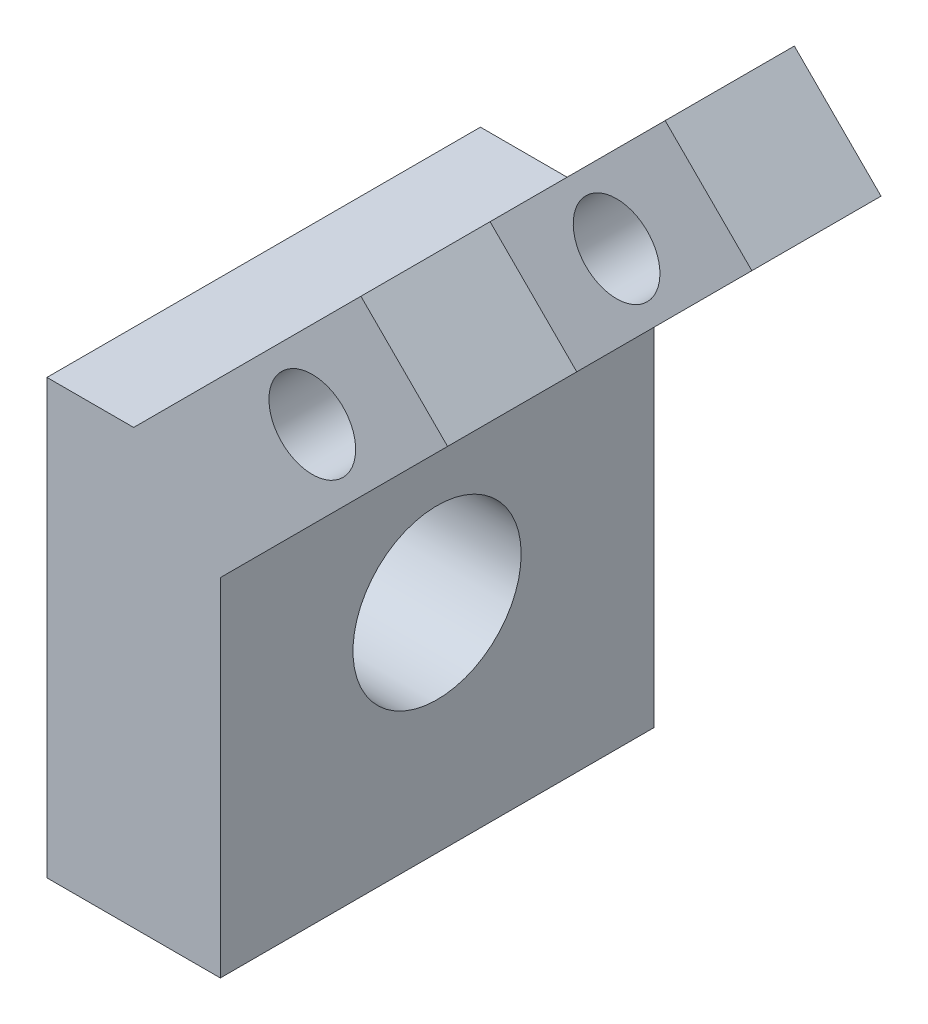
ISO-10303-21;
HEADER;
FILE_DESCRIPTION(('STEP AP214'),'2;1');
FILE_NAME('part.step','',(''),(''),'','','');
FILE_SCHEMA(('AUTOMOTIVE_DESIGN { 1 0 10303 214 1 1 1 1 }'));
ENDSEC;
DATA;
#1=APPLICATION_CONTEXT('core data for automotive mechanical design processes');
#2=APPLICATION_PROTOCOL_DEFINITION('international standard','automotive_design',2000,#1);
#3=PRODUCT_CONTEXT('',#1,'mechanical');
#4=PRODUCT('Part','Part','',(#3));
#5=PRODUCT_RELATED_PRODUCT_CATEGORY('part','',(#4));
#6=PRODUCT_DEFINITION_FORMATION('','',#4);
#7=PRODUCT_DEFINITION_CONTEXT('part definition',#1,'design');
#8=PRODUCT_DEFINITION('design','',#6,#7);
#9=PRODUCT_DEFINITION_SHAPE('','',#8);
#10=(LENGTH_UNIT() NAMED_UNIT(*) SI_UNIT(.MILLI.,.METRE.));
#11=(NAMED_UNIT(*) PLANE_ANGLE_UNIT() SI_UNIT($,.RADIAN.));
#12=(NAMED_UNIT(*) SI_UNIT($,.STERADIAN.) SOLID_ANGLE_UNIT());
#13=UNCERTAINTY_MEASURE_WITH_UNIT(LENGTH_MEASURE(1.E-05),#10,'distance_accuracy_value','');
#14=(GEOMETRIC_REPRESENTATION_CONTEXT(3) GLOBAL_UNCERTAINTY_ASSIGNED_CONTEXT((#13)) GLOBAL_UNIT_ASSIGNED_CONTEXT((#10,
#11,#12)) REPRESENTATION_CONTEXT('',''));
#15=CARTESIAN_POINT('',(0.,0.,0.));
#16=DIRECTION('',(0.,0.,1.));
#17=DIRECTION('',(1.,0.,0.));
#18=AXIS2_PLACEMENT_3D('',#15,#16,#17);
#19=CARTESIAN_POINT('',(31.154556589281,29.113189291429,18.75));
#20=DIRECTION('',(-0.707106781186549,0.707106781186546,0.));
#21=DIRECTION('',(-0.707106781186546,-0.707106781186549,0.));
#22=AXIS2_PLACEMENT_3D('',#19,#20,#21);
#23=PLANE('',#22);
#24=DIRECTION('',(0.707106781186546,0.707106781186549,0.));
#25=VECTOR('',#24,1.);
#26=CARTESIAN_POINT('',(11.4946540125837,9.4532867147316,-7.575));
#27=LINE('',#26,#25);
#28=CARTESIAN_POINT('',(11.4946540125837,9.4532867147316,-7.575));
#29=VERTEX_POINT('',#28);
#30=CARTESIAN_POINT('',(31.154556589281,29.113189291429,-7.575));
#31=VERTEX_POINT('',#30);
#32=EDGE_CURVE('E124',#29,#31,#27,.T.);
#33=ORIENTED_EDGE('',*,*,#32,.F.);
#34=DIRECTION('',(0.,0.,-1.));
#35=VECTOR('',#34,1.);
#36=CARTESIAN_POINT('',(11.4946540125837,9.4532867147316,18.75));
#37=LINE('',#36,#35);
#38=CARTESIAN_POINT('',(11.4946540125837,9.4532867147316,-18.75));
#39=VERTEX_POINT('',#38);
#40=EDGE_CURVE('E154',#29,#39,#37,.T.);
#41=ORIENTED_EDGE('',*,*,#40,.T.);
#42=DIRECTION('',(0.707106781186546,0.707106781186549,0.));
#43=VECTOR('',#42,1.);
#44=CARTESIAN_POINT('',(31.154556589281,29.113189291429,-18.75));
#45=LINE('',#44,#43);
#46=CARTESIAN_POINT('',(31.154556589281,29.113189291429,-18.75));
#47=VERTEX_POINT('',#46);
#48=EDGE_CURVE('E148',#39,#47,#45,.T.);
#49=ORIENTED_EDGE('',*,*,#48,.T.);
#50=DIRECTION('',(0.,0.,-1.));
#51=VECTOR('',#50,1.);
#52=CARTESIAN_POINT('',(31.154556589281,29.113189291429,18.75));
#53=LINE('',#52,#51);
#54=EDGE_CURVE('E142',#31,#47,#53,.T.);
#55=ORIENTED_EDGE('',*,*,#54,.F.);
#56=EDGE_LOOP('',(#33,#41,#49,#55));
#57=FACE_BOUND('',#56,.T.);
#58=ADVANCED_FACE('F34',(#57),#23,.F.);
#59=CARTESIAN_POINT('',(23.654556589281,36.613189291429,18.75));
#60=DIRECTION('',(-0.707106781186546,-0.707106781186549,0.));
#61=DIRECTION('',(0.707106781186549,-0.707106781186546,0.));
#62=AXIS2_PLACEMENT_3D('',#59,#60,#61);
#63=PLANE('',#62);
#64=DIRECTION('',(-0.707106781186549,0.707106781186546,0.));
#65=VECTOR('',#64,1.);
#66=CARTESIAN_POINT('',(31.154556589281,29.113189291429,-7.575));
#67=LINE('',#66,#65);
#68=CARTESIAN_POINT('',(23.654556589281,36.613189291429,-7.575));
#69=VERTEX_POINT('',#68);
#70=EDGE_CURVE('E128',#31,#69,#67,.T.);
#71=ORIENTED_EDGE('',*,*,#70,.F.);
#72=ORIENTED_EDGE('',*,*,#54,.T.);
#73=DIRECTION('',(-0.707106781186549,0.707106781186546,0.));
#74=VECTOR('',#73,1.);
#75=CARTESIAN_POINT('',(23.654556589281,36.613189291429,-18.75));
#76=LINE('',#75,#74);
#77=CARTESIAN_POINT('',(23.654556589281,36.613189291429,-18.75));
#78=VERTEX_POINT('',#77);
#79=EDGE_CURVE('E237',#47,#78,#76,.T.);
#80=ORIENTED_EDGE('',*,*,#79,.T.);
#81=DIRECTION('',(0.,0.,-1.));
#82=VECTOR('',#81,1.);
#83=CARTESIAN_POINT('',(23.654556589281,36.613189291429,18.75));
#84=LINE('',#83,#82);
#85=EDGE_CURVE('E144',#69,#78,#84,.T.);
#86=ORIENTED_EDGE('',*,*,#85,.F.);
#87=EDGE_LOOP('',(#71,#72,#80,#86));
#88=FACE_BOUND('',#87,.T.);
#89=ADVANCED_FACE('F140',(#88),#63,.F.);
#90=CARTESIAN_POINT('',(3.99465401258368,16.9532867147316,18.75));
#91=DIRECTION('',(0.707106781186549,-0.707106781186546,0.));
#92=DIRECTION('',(0.707106781186546,0.707106781186549,0.));
#93=AXIS2_PLACEMENT_3D('',#90,#91,#92);
#94=PLANE('',#93);
#95=DIRECTION('',(-0.707106781186546,-0.707106781186549,0.));
#96=VECTOR('',#95,1.);
#97=CARTESIAN_POINT('',(23.654556589281,36.613189291429,-7.575));
#98=LINE('',#97,#96);
#99=CARTESIAN_POINT('',(3.99465401258368,16.9532867147316,-7.575));
#100=VERTEX_POINT('',#99);
#101=EDGE_CURVE('E145',#69,#100,#98,.T.);
#102=ORIENTED_EDGE('',*,*,#101,.F.);
#103=ORIENTED_EDGE('',*,*,#85,.T.);
#104=DIRECTION('',(-0.707106781186546,-0.707106781186549,0.));
#105=VECTOR('',#104,1.);
#106=CARTESIAN_POINT('',(3.99465401258368,16.9532867147316,-18.75));
#107=LINE('',#106,#105);
#108=CARTESIAN_POINT('',(3.99465401258368,16.9532867147316,-18.75));
#109=VERTEX_POINT('',#108);
#110=EDGE_CURVE('E223',#78,#109,#107,.T.);
#111=ORIENTED_EDGE('',*,*,#110,.T.);
#112=DIRECTION('',(0.,0.,-1.));
#113=VECTOR('',#112,1.);
#114=CARTESIAN_POINT('',(3.99465401258368,16.9532867147316,18.75));
#115=LINE('',#114,#113);
#116=EDGE_CURVE('E232',#100,#109,#115,.T.);
#117=ORIENTED_EDGE('',*,*,#116,.F.);
#118=EDGE_LOOP('',(#102,#103,#111,#117));
#119=FACE_BOUND('',#118,.T.);
#120=ADVANCED_FACE('F245',(#119),#94,.F.);
#121=CARTESIAN_POINT('',(11.4946540125837,-1.79671328526836,0.));
#122=DIRECTION('',(1.,0.,0.));
#123=DIRECTION('',(0.,0.,-1.));
#124=AXIS2_PLACEMENT_3D('',#121,#122,#123);
#125=PLANE('',#124);
#126=CARTESIAN_POINT('',(11.4946540125837,-1.79671328526836,0.));
#127=DIRECTION('',(1.,0.,0.));
#128=DIRECTION('',(0.,0.,-1.));
#129=AXIS2_PLACEMENT_3D('',#126,#127,#128);
#130=CIRCLE('',#129,7.275);
#131=CARTESIAN_POINT('',(11.4946540125837,-1.79671328526836,-7.275));
#132=VERTEX_POINT('',#131);
#133=EDGE_CURVE('E163',#132,#132,#130,.T.);
#134=ORIENTED_EDGE('',*,*,#133,.F.);
#135=EDGE_LOOP('',(#134));
#136=FACE_BOUND('',#135,.T.);
#137=DIRECTION('',(0.,1.,0.));
#138=VECTOR('',#137,1.);
#139=CARTESIAN_POINT('',(11.4946540125837,16.9532867147316,-18.75));
#140=LINE('',#139,#138);
#141=CARTESIAN_POINT('',(11.4946540125837,-20.5467132852684,-18.75));
#142=VERTEX_POINT('',#141);
#143=EDGE_CURVE('E169',#142,#39,#140,.T.);
#144=ORIENTED_EDGE('',*,*,#143,.T.);
#145=ORIENTED_EDGE('',*,*,#40,.F.);
#146=DIRECTION('',(0.,-1.,0.));
#147=VECTOR('',#146,1.);
#148=CARTESIAN_POINT('',(11.4946540125837,9.4532867147316,-7.575));
#149=LINE('',#148,#147);
#150=CARTESIAN_POINT('',(11.4946540125837,16.9532867147316,-7.575));
#151=VERTEX_POINT('',#150);
#152=EDGE_CURVE('E132',#151,#29,#149,.T.);
#153=ORIENTED_EDGE('',*,*,#152,.F.);
#154=DIRECTION('',(0.,0.,1.));
#155=VECTOR('',#154,1.);
#156=CARTESIAN_POINT('',(11.4946540125837,16.9532867147316,-7.575));
#157=LINE('',#156,#155);
#158=CARTESIAN_POINT('',(11.4946540125837,16.9532867147316,7.575));
#159=VERTEX_POINT('',#158);
#160=EDGE_CURVE('E238',#151,#159,#157,.T.);
#161=ORIENTED_EDGE('',*,*,#160,.T.);
#162=DIRECTION('',(0.,-1.,0.));
#163=VECTOR('',#162,1.);
#164=CARTESIAN_POINT('',(11.4946540125837,9.4532867147316,7.575));
#165=LINE('',#164,#163);
#166=CARTESIAN_POINT('',(11.4946540125837,9.4532867147316,7.575));
#167=VERTEX_POINT('',#166);
#168=EDGE_CURVE('E136',#159,#167,#165,.T.);
#169=ORIENTED_EDGE('',*,*,#168,.T.);
#170=CARTESIAN_POINT('',(11.4946540125837,9.4532867147316,18.75));
#171=VERTEX_POINT('',#170);
#172=EDGE_CURVE('E159',#171,#167,#37,.T.);
#173=ORIENTED_EDGE('',*,*,#172,.F.);
#174=DIRECTION('',(0.,-1.,0.));
#175=VECTOR('',#174,1.);
#176=CARTESIAN_POINT('',(11.4946540125837,16.9532867147316,18.75));
#177=LINE('',#176,#175);
#178=CARTESIAN_POINT('',(11.4946540125837,-20.5467132852684,18.75));
#179=VERTEX_POINT('',#178);
#180=EDGE_CURVE('E172',#171,#179,#177,.T.);
#181=ORIENTED_EDGE('',*,*,#180,.T.);
#182=DIRECTION('',(0.,0.,-1.));
#183=VECTOR('',#182,1.);
#184=CARTESIAN_POINT('',(11.4946540125837,-20.5467132852684,18.75));
#185=LINE('',#184,#183);
#186=EDGE_CURVE('E175',#179,#142,#185,.T.);
#187=ORIENTED_EDGE('',*,*,#186,.T.);
#188=EDGE_LOOP('',(#144,#145,#153,#161,#169,#173,#181,#187));
#189=FACE_BOUND('',#188,.T.);
#190=ADVANCED_FACE('F214',(#136,#189),#125,.T.);
#191=CARTESIAN_POINT('',(11.4946540125837,16.9532867147316,18.75));
#192=DIRECTION('',(0.,-1.,0.));
#193=DIRECTION('',(0.,0.,-1.));
#194=AXIS2_PLACEMENT_3D('',#191,#192,#193);
#195=PLANE('',#194);
#196=CARTESIAN_POINT('',(3.99465401258368,16.9532867147316,18.75));
#197=VERTEX_POINT('',#196);
#198=CARTESIAN_POINT('',(3.99465401258368,16.9532867147316,7.575));
#199=VERTEX_POINT('',#198);
#200=EDGE_CURVE('E57',#197,#199,#115,.T.);
#201=ORIENTED_EDGE('',*,*,#200,.T.);
#202=DIRECTION('',(1.,0.,0.));
#203=VECTOR('',#202,1.);
#204=CARTESIAN_POINT('',(3.99465401258368,16.9532867147316,7.575));
#205=LINE('',#204,#203);
#206=EDGE_CURVE('E50',#199,#159,#205,.T.);
#207=ORIENTED_EDGE('',*,*,#206,.T.);
#208=ORIENTED_EDGE('',*,*,#160,.F.);
#209=DIRECTION('',(1.,0.,0.));
#210=VECTOR('',#209,1.);
#211=CARTESIAN_POINT('',(3.99465401258368,16.9532867147316,-7.575));
#212=LINE('',#211,#210);
#213=EDGE_CURVE('E242',#100,#151,#212,.T.);
#214=ORIENTED_EDGE('',*,*,#213,.F.);
#215=ORIENTED_EDGE('',*,*,#116,.T.);
#216=DIRECTION('',(-1.,0.,0.));
#217=VECTOR('',#216,1.);
#218=CARTESIAN_POINT('',(11.4946540125837,16.9532867147316,-18.75));
#219=LINE('',#218,#217);
#220=CARTESIAN_POINT('',(-3.50534598741632,16.9532867147316,-18.75));
#221=VERTEX_POINT('',#220);
#222=EDGE_CURVE('E11',#109,#221,#219,.T.);
#223=ORIENTED_EDGE('',*,*,#222,.T.);
#224=DIRECTION('',(0.,0.,1.));
#225=VECTOR('',#224,1.);
#226=CARTESIAN_POINT('',(-3.50534598741632,16.9532867147316,18.75));
#227=LINE('',#226,#225);
#228=CARTESIAN_POINT('',(-3.50534598741632,16.9532867147316,18.75));
#229=VERTEX_POINT('',#228);
#230=EDGE_CURVE('E180',#221,#229,#227,.T.);
#231=ORIENTED_EDGE('',*,*,#230,.T.);
#232=DIRECTION('',(-1.,0.,0.));
#233=VECTOR('',#232,1.);
#234=CARTESIAN_POINT('',(11.4946540125837,16.9532867147316,18.75));
#235=LINE('',#234,#233);
#236=EDGE_CURVE('E43',#197,#229,#235,.T.);
#237=ORIENTED_EDGE('',*,*,#236,.F.);
#238=EDGE_LOOP('',(#201,#207,#208,#214,#215,#223,#231,#237));
#239=FACE_BOUND('',#238,.T.);
#240=ADVANCED_FACE('F200',(#239),#195,.F.);
#241=CARTESIAN_POINT('',(-3.50534598741632,-1.79671328526836,0.));
#242=DIRECTION('',(1.,0.,0.));
#243=DIRECTION('',(0.,0.,-1.));
#244=AXIS2_PLACEMENT_3D('',#241,#242,#243);
#245=PLANE('',#244);
#246=DIRECTION('',(0.,1.,0.));
#247=VECTOR('',#246,1.);
#248=CARTESIAN_POINT('',(-3.50534598741632,16.9532867147316,-18.75));
#249=LINE('',#248,#247);
#250=CARTESIAN_POINT('',(-3.50534598741632,-20.5467132852684,-18.75));
#251=VERTEX_POINT('',#250);
#252=EDGE_CURVE('E166',#251,#221,#249,.T.);
#253=ORIENTED_EDGE('',*,*,#252,.F.);
#254=DIRECTION('',(0.,0.,-1.));
#255=VECTOR('',#254,1.);
#256=CARTESIAN_POINT('',(-3.50534598741632,-20.5467132852684,18.75));
#257=LINE('',#256,#255);
#258=CARTESIAN_POINT('',(-3.50534598741632,-20.5467132852684,18.75));
#259=VERTEX_POINT('',#258);
#260=EDGE_CURVE('E173',#259,#251,#257,.T.);
#261=ORIENTED_EDGE('',*,*,#260,.F.);
#262=DIRECTION('',(0.,-1.,0.));
#263=VECTOR('',#262,1.);
#264=CARTESIAN_POINT('',(-3.50534598741632,16.9532867147316,18.75));
#265=LINE('',#264,#263);
#266=EDGE_CURVE('E183',#229,#259,#265,.T.);
#267=ORIENTED_EDGE('',*,*,#266,.F.);
#268=ORIENTED_EDGE('',*,*,#230,.F.);
#269=EDGE_LOOP('',(#253,#261,#267,#268));
#270=FACE_BOUND('',#269,.T.);
#271=CARTESIAN_POINT('',(-3.50534598741632,-1.79671328526836,0.));
#272=DIRECTION('',(1.,0.,0.));
#273=DIRECTION('',(0.,0.,-1.));
#274=AXIS2_PLACEMENT_3D('',#271,#272,#273);
#275=CIRCLE('',#274,7.275);
#276=CARTESIAN_POINT('',(-3.50534598741632,-1.79671328526836,-7.275));
#277=VERTEX_POINT('',#276);
#278=EDGE_CURVE('E162',#277,#277,#275,.T.);
#279=ORIENTED_EDGE('',*,*,#278,.T.);
#280=EDGE_LOOP('',(#279));
#281=FACE_BOUND('',#280,.T.);
#282=ADVANCED_FACE('F205',(#270,#281),#245,.F.);
#283=CARTESIAN_POINT('',(11.4946540125837,16.9532867147316,-18.75));
#284=DIRECTION('',(0.,0.,1.));
#285=DIRECTION('',(0.,-1.,0.));
#286=AXIS2_PLACEMENT_3D('',#283,#284,#285);
#287=PLANE('',#286);
#288=CARTESIAN_POINT('',(19.4496053009323,24.9082380030803,-18.75));
#289=DIRECTION('',(0.,0.,-1.));
#290=DIRECTION('',(0.,1.,0.));
#291=AXIS2_PLACEMENT_3D('',#288,#289,#290);
#292=CIRCLE('',#291,3.75);
#293=CARTESIAN_POINT('',(19.4496053009323,28.6582380030803,-18.75));
#294=VERTEX_POINT('',#293);
#295=EDGE_CURVE('E381',#294,#294,#292,.T.);
#296=ORIENTED_EDGE('',*,*,#295,.F.);
#297=EDGE_LOOP('',(#296));
#298=FACE_BOUND('',#297,.T.);
#299=ORIENTED_EDGE('',*,*,#48,.F.);
#300=ORIENTED_EDGE('',*,*,#143,.F.);
#301=DIRECTION('',(-1.,0.,0.));
#302=VECTOR('',#301,1.);
#303=CARTESIAN_POINT('',(11.4946540125837,-20.5467132852684,-18.75));
#304=LINE('',#303,#302);
#305=EDGE_CURVE('E177',#142,#251,#304,.T.);
#306=ORIENTED_EDGE('',*,*,#305,.T.);
#307=ORIENTED_EDGE('',*,*,#252,.T.);
#308=ORIENTED_EDGE('',*,*,#222,.F.);
#309=ORIENTED_EDGE('',*,*,#110,.F.);
#310=ORIENTED_EDGE('',*,*,#79,.F.);
#311=EDGE_LOOP('',(#299,#300,#306,#307,#308,#309,#310));
#312=FACE_BOUND('',#311,.T.);
#313=ADVANCED_FACE('F36',(#298,#312),#287,.F.);
#314=CARTESIAN_POINT('',(11.4946540125837,16.9532867147316,18.75));
#315=DIRECTION('',(0.,0.,-1.));
#316=DIRECTION('',(0.,1.,0.));
#317=AXIS2_PLACEMENT_3D('',#314,#315,#316);
#318=PLANE('',#317);
#319=CARTESIAN_POINT('',(19.4496053009323,24.9082380030803,18.75));
#320=DIRECTION('',(0.,0.,-1.));
#321=DIRECTION('',(0.,1.,0.));
#322=AXIS2_PLACEMENT_3D('',#319,#320,#321);
#323=CIRCLE('',#322,3.75);
#324=CARTESIAN_POINT('',(19.4496053009323,28.6582380030803,18.75));
#325=VERTEX_POINT('',#324);
#326=EDGE_CURVE('E382',#325,#325,#323,.T.);
#327=ORIENTED_EDGE('',*,*,#326,.T.);
#328=EDGE_LOOP('',(#327));
#329=FACE_BOUND('',#328,.T.);
#330=ORIENTED_EDGE('',*,*,#180,.F.);
#331=DIRECTION('',(0.707106781186546,0.707106781186549,0.));
#332=VECTOR('',#331,1.);
#333=CARTESIAN_POINT('',(31.154556589281,29.113189291429,18.75));
#334=LINE('',#333,#332);
#335=CARTESIAN_POINT('',(31.154556589281,29.113189291429,18.75));
#336=VERTEX_POINT('',#335);
#337=EDGE_CURVE('E217',#171,#336,#334,.T.);
#338=ORIENTED_EDGE('',*,*,#337,.T.);
#339=DIRECTION('',(-0.707106781186549,0.707106781186546,0.));
#340=VECTOR('',#339,1.);
#341=CARTESIAN_POINT('',(23.654556589281,36.613189291429,18.75));
#342=LINE('',#341,#340);
#343=CARTESIAN_POINT('',(23.654556589281,36.613189291429,18.75));
#344=VERTEX_POINT('',#343);
#345=EDGE_CURVE('E220',#336,#344,#342,.T.);
#346=ORIENTED_EDGE('',*,*,#345,.T.);
#347=DIRECTION('',(-0.707106781186546,-0.707106781186549,0.));
#348=VECTOR('',#347,1.);
#349=CARTESIAN_POINT('',(3.99465401258368,16.9532867147316,18.75));
#350=LINE('',#349,#348);
#351=EDGE_CURVE('E197',#344,#197,#350,.T.);
#352=ORIENTED_EDGE('',*,*,#351,.T.);
#353=ORIENTED_EDGE('',*,*,#236,.T.);
#354=ORIENTED_EDGE('',*,*,#266,.T.);
#355=DIRECTION('',(-1.,0.,0.));
#356=VECTOR('',#355,1.);
#357=CARTESIAN_POINT('',(11.4946540125837,-20.5467132852684,18.75));
#358=LINE('',#357,#356);
#359=EDGE_CURVE('E188',#179,#259,#358,.T.);
#360=ORIENTED_EDGE('',*,*,#359,.F.);
#361=EDGE_LOOP('',(#330,#338,#346,#352,#353,#354,#360));
#362=FACE_BOUND('',#361,.T.);
#363=ADVANCED_FACE('F194',(#329,#362),#318,.F.);
#364=CARTESIAN_POINT('',(11.4946540125837,-20.5467132852684,18.75));
#365=DIRECTION('',(0.,1.,0.));
#366=DIRECTION('',(0.,0.,1.));
#367=AXIS2_PLACEMENT_3D('',#364,#365,#366);
#368=PLANE('',#367);
#369=ORIENTED_EDGE('',*,*,#260,.T.);
#370=ORIENTED_EDGE('',*,*,#305,.F.);
#371=ORIENTED_EDGE('',*,*,#186,.F.);
#372=ORIENTED_EDGE('',*,*,#359,.T.);
#373=EDGE_LOOP('',(#369,#370,#371,#372));
#374=FACE_BOUND('',#373,.T.);
#375=ADVANCED_FACE('F209',(#374),#368,.F.);
#376=CARTESIAN_POINT('',(11.4946540125837,-1.79671328526836,0.));
#377=DIRECTION('',(-1.,0.,0.));
#378=DIRECTION('',(0.,0.,1.));
#379=AXIS2_PLACEMENT_3D('',#376,#377,#378);
#380=CYLINDRICAL_SURFACE('',#379,7.275);
#381=ORIENTED_EDGE('',*,*,#133,.T.);
#382=EDGE_LOOP('',(#381));
#383=FACE_BOUND('',#382,.T.);
#384=ORIENTED_EDGE('',*,*,#278,.F.);
#385=EDGE_LOOP('',(#384));
#386=FACE_BOUND('',#385,.T.);
#387=ADVANCED_FACE('F277',(#383,#386),#380,.F.);
#388=ORIENTED_EDGE('',*,*,#172,.T.);
#389=DIRECTION('',(0.707106781186546,0.707106781186549,0.));
#390=VECTOR('',#389,1.);
#391=CARTESIAN_POINT('',(11.4946540125837,9.4532867147316,7.575));
#392=LINE('',#391,#390);
#393=CARTESIAN_POINT('',(31.154556589281,29.113189291429,7.575));
#394=VERTEX_POINT('',#393);
#395=EDGE_CURVE('E227',#167,#394,#392,.T.);
#396=ORIENTED_EDGE('',*,*,#395,.T.);
#397=EDGE_CURVE('E150',#336,#394,#53,.T.);
#398=ORIENTED_EDGE('',*,*,#397,.F.);
#399=ORIENTED_EDGE('',*,*,#337,.F.);
#400=EDGE_LOOP('',(#388,#396,#398,#399));
#401=FACE_BOUND('',#400,.T.);
#402=ADVANCED_FACE('F226',(#401),#23,.F.);
#403=ORIENTED_EDGE('',*,*,#397,.T.);
#404=DIRECTION('',(-0.707106781186549,0.707106781186546,0.));
#405=VECTOR('',#404,1.);
#406=CARTESIAN_POINT('',(31.154556589281,29.113189291429,7.575));
#407=LINE('',#406,#405);
#408=CARTESIAN_POINT('',(23.654556589281,36.613189291429,7.575));
#409=VERTEX_POINT('',#408);
#410=EDGE_CURVE('E251',#394,#409,#407,.T.);
#411=ORIENTED_EDGE('',*,*,#410,.T.);
#412=EDGE_CURVE('E151',#344,#409,#84,.T.);
#413=ORIENTED_EDGE('',*,*,#412,.F.);
#414=ORIENTED_EDGE('',*,*,#345,.F.);
#415=EDGE_LOOP('',(#403,#411,#413,#414));
#416=FACE_BOUND('',#415,.T.);
#417=ADVANCED_FACE('F230',(#416),#63,.F.);
#418=ORIENTED_EDGE('',*,*,#412,.T.);
#419=DIRECTION('',(-0.707106781186546,-0.707106781186549,0.));
#420=VECTOR('',#419,1.);
#421=CARTESIAN_POINT('',(23.654556589281,36.613189291429,7.575));
#422=LINE('',#421,#420);
#423=EDGE_CURVE('E254',#409,#199,#422,.T.);
#424=ORIENTED_EDGE('',*,*,#423,.T.);
#425=ORIENTED_EDGE('',*,*,#200,.F.);
#426=ORIENTED_EDGE('',*,*,#351,.F.);
#427=EDGE_LOOP('',(#418,#424,#425,#426));
#428=FACE_BOUND('',#427,.T.);
#429=ADVANCED_FACE('F258',(#428),#94,.F.);
#430=CARTESIAN_POINT('',(-3.50534598741632,-1.79671328526836,-7.575));
#431=DIRECTION('',(0.,0.,1.));
#432=DIRECTION('',(1.,0.,0.));
#433=AXIS2_PLACEMENT_3D('',#430,#431,#432);
#434=PLANE('',#433);
#435=CARTESIAN_POINT('',(19.4496053009323,24.9082380030803,-7.575));
#436=DIRECTION('',(0.,0.,1.));
#437=DIRECTION('',(1.,0.,0.));
#438=AXIS2_PLACEMENT_3D('',#435,#436,#437);
#439=CIRCLE('',#438,3.75);
#440=CARTESIAN_POINT('',(19.4496053009323,28.6582380030803,-7.575));
#441=VERTEX_POINT('',#440);
#442=EDGE_CURVE('E252',#441,#441,#439,.T.);
#443=ORIENTED_EDGE('',*,*,#442,.F.);
#444=EDGE_LOOP('',(#443));
#445=FACE_BOUND('',#444,.T.);
#446=ORIENTED_EDGE('',*,*,#32,.T.);
#447=ORIENTED_EDGE('',*,*,#70,.T.);
#448=ORIENTED_EDGE('',*,*,#101,.T.);
#449=ORIENTED_EDGE('',*,*,#213,.T.);
#450=ORIENTED_EDGE('',*,*,#152,.T.);
#451=EDGE_LOOP('',(#446,#447,#448,#449,#450));
#452=FACE_BOUND('',#451,.T.);
#453=ADVANCED_FACE('F126',(#445,#452),#434,.T.);
#454=CARTESIAN_POINT('',(-3.50534598741632,-1.79671328526836,7.575));
#455=DIRECTION('',(0.,0.,1.));
#456=DIRECTION('',(1.,0.,0.));
#457=AXIS2_PLACEMENT_3D('',#454,#455,#456);
#458=PLANE('',#457);
#459=CARTESIAN_POINT('',(19.4496053009323,24.9082380030803,7.575));
#460=DIRECTION('',(0.,0.,1.));
#461=DIRECTION('',(1.,0.,0.));
#462=AXIS2_PLACEMENT_3D('',#459,#460,#461);
#463=CIRCLE('',#462,3.75);
#464=CARTESIAN_POINT('',(19.4496053009323,28.6582380030803,7.575));
#465=VERTEX_POINT('',#464);
#466=EDGE_CURVE('E38',#465,#465,#463,.T.);
#467=ORIENTED_EDGE('',*,*,#466,.T.);
#468=EDGE_LOOP('',(#467));
#469=FACE_BOUND('',#468,.T.);
#470=ORIENTED_EDGE('',*,*,#395,.F.);
#471=ORIENTED_EDGE('',*,*,#168,.F.);
#472=ORIENTED_EDGE('',*,*,#206,.F.);
#473=ORIENTED_EDGE('',*,*,#423,.F.);
#474=ORIENTED_EDGE('',*,*,#410,.F.);
#475=EDGE_LOOP('',(#470,#471,#472,#473,#474));
#476=FACE_BOUND('',#475,.T.);
#477=ADVANCED_FACE('F257',(#469,#476),#458,.F.);
#478=CARTESIAN_POINT('',(19.4496053009323,24.9082380030803,18.75));
#479=DIRECTION('',(0.,0.,-1.));
#480=DIRECTION('',(0.,1.,0.));
#481=AXIS2_PLACEMENT_3D('',#478,#479,#480);
#482=CYLINDRICAL_SURFACE('',#481,3.75);
#483=CARTESIAN_POINT('',(19.4496053009323,28.6582380030803,18.75));
#484=CARTESIAN_POINT('',(19.4496053009323,28.6582380030803,18.63359375));
#485=CARTESIAN_POINT('',(19.4496053009323,28.6582380030803,18.5171875));
#486=CARTESIAN_POINT('',(19.4496053009323,28.6582380030803,18.284375));
#487=CARTESIAN_POINT('',(19.4496053009323,28.6582380030803,18.16796875));
#488=CARTESIAN_POINT('',(19.4496053009323,28.6582380030803,17.93515625));
#489=CARTESIAN_POINT('',(19.4496053009323,28.6582380030803,17.81875));
#490=CARTESIAN_POINT('',(19.4496053009323,28.6582380030803,17.5859375));
#491=CARTESIAN_POINT('',(19.4496053009323,28.6582380030803,17.46953125));
#492=CARTESIAN_POINT('',(19.4496053009323,28.6582380030803,17.23671875));
#493=CARTESIAN_POINT('',(19.4496053009323,28.6582380030803,17.1203125));
#494=CARTESIAN_POINT('',(19.4496053009323,28.6582380030803,16.8875));
#495=CARTESIAN_POINT('',(19.4496053009323,28.6582380030803,16.77109375));
#496=CARTESIAN_POINT('',(19.4496053009323,28.6582380030803,16.53828125));
#497=CARTESIAN_POINT('',(19.4496053009323,28.6582380030803,16.421875));
#498=CARTESIAN_POINT('',(19.4496053009323,28.6582380030803,16.1890625));
#499=CARTESIAN_POINT('',(19.4496053009323,28.6582380030803,16.07265625));
#500=CARTESIAN_POINT('',(19.4496053009323,28.6582380030803,15.83984375));
#501=CARTESIAN_POINT('',(19.4496053009323,28.6582380030803,15.7234375));
#502=CARTESIAN_POINT('',(19.4496053009323,28.6582380030803,15.490625));
#503=CARTESIAN_POINT('',(19.4496053009323,28.6582380030803,15.37421875));
#504=CARTESIAN_POINT('',(19.4496053009323,28.6582380030803,15.14140625));
#505=CARTESIAN_POINT('',(19.4496053009323,28.6582380030803,15.025));
#506=CARTESIAN_POINT('',(19.4496053009323,28.6582380030803,14.7921875));
#507=CARTESIAN_POINT('',(19.4496053009323,28.6582380030803,14.67578125));
#508=CARTESIAN_POINT('',(19.4496053009323,28.6582380030803,14.44296875));
#509=CARTESIAN_POINT('',(19.4496053009323,28.6582380030803,14.3265625));
#510=CARTESIAN_POINT('',(19.4496053009323,28.6582380030803,14.09375));
#511=CARTESIAN_POINT('',(19.4496053009323,28.6582380030803,13.97734375));
#512=CARTESIAN_POINT('',(19.4496053009323,28.6582380030803,13.74453125));
#513=CARTESIAN_POINT('',(19.4496053009323,28.6582380030803,13.628125));
#514=CARTESIAN_POINT('',(19.4496053009323,28.6582380030803,13.3953125));
#515=CARTESIAN_POINT('',(19.4496053009323,28.6582380030803,13.27890625));
#516=CARTESIAN_POINT('',(19.4496053009323,28.6582380030803,13.04609375));
#517=CARTESIAN_POINT('',(19.4496053009323,28.6582380030803,12.9296875));
#518=CARTESIAN_POINT('',(19.4496053009323,28.6582380030803,12.696875));
#519=CARTESIAN_POINT('',(19.4496053009323,28.6582380030803,12.58046875));
#520=CARTESIAN_POINT('',(19.4496053009323,28.6582380030803,12.34765625));
#521=CARTESIAN_POINT('',(19.4496053009323,28.6582380030803,12.23125));
#522=CARTESIAN_POINT('',(19.4496053009323,28.6582380030803,11.9984375));
#523=CARTESIAN_POINT('',(19.4496053009323,28.6582380030803,11.88203125));
#524=CARTESIAN_POINT('',(19.4496053009323,28.6582380030803,11.64921875));
#525=CARTESIAN_POINT('',(19.4496053009323,28.6582380030803,11.5328125));
#526=CARTESIAN_POINT('',(19.4496053009323,28.6582380030803,11.3));
#527=CARTESIAN_POINT('',(19.4496053009323,28.6582380030803,11.18359375));
#528=CARTESIAN_POINT('',(19.4496053009323,28.6582380030803,10.95078125));
#529=CARTESIAN_POINT('',(19.4496053009323,28.6582380030803,10.834375));
#530=CARTESIAN_POINT('',(19.4496053009323,28.6582380030803,10.6015625));
#531=CARTESIAN_POINT('',(19.4496053009323,28.6582380030803,10.48515625));
#532=CARTESIAN_POINT('',(19.4496053009323,28.6582380030803,10.25234375));
#533=CARTESIAN_POINT('',(19.4496053009323,28.6582380030803,10.1359375));
#534=CARTESIAN_POINT('',(19.4496053009323,28.6582380030803,9.903125));
#535=CARTESIAN_POINT('',(19.4496053009323,28.6582380030803,9.78671875));
#536=CARTESIAN_POINT('',(19.4496053009323,28.6582380030803,9.55390625));
#537=CARTESIAN_POINT('',(19.4496053009323,28.6582380030803,9.4375));
#538=CARTESIAN_POINT('',(19.4496053009323,28.6582380030803,9.2046875));
#539=CARTESIAN_POINT('',(19.4496053009323,28.6582380030803,9.08828125));
#540=CARTESIAN_POINT('',(19.4496053009323,28.6582380030803,8.85546875));
#541=CARTESIAN_POINT('',(19.4496053009323,28.6582380030803,8.7390625));
#542=CARTESIAN_POINT('',(19.4496053009323,28.6582380030803,8.50625));
#543=CARTESIAN_POINT('',(19.4496053009323,28.6582380030803,8.38984375));
#544=CARTESIAN_POINT('',(19.4496053009323,28.6582380030803,8.15703125));
#545=CARTESIAN_POINT('',(19.4496053009323,28.6582380030803,8.040625));
#546=CARTESIAN_POINT('',(19.4496053009323,28.6582380030803,7.8078125));
#547=CARTESIAN_POINT('',(19.4496053009323,28.6582380030803,7.69140625));
#548=CARTESIAN_POINT('',(19.4496053009323,28.6582380030803,7.575));
#549=B_SPLINE_CURVE_WITH_KNOTS('',3,(#483,#484,#485,#486,#487,#488,#489,#490,#491,#492,#493,
#494,#495,#496,#497,#498,#499,#500,#501,#502,#503,#504,#505,#506,#507,#508,#509,#510,#511,#512,
#513,#514,#515,#516,#517,#518,#519,#520,#521,#522,#523,#524,#525,#526,#527,#528,#529,#530,#531,
#532,#533,#534,#535,#536,#537,#538,#539,#540,#541,#542,#543,#544,#545,#546,#547,#548),
.UNSPECIFIED.,.F.,.F.,(4,2,2,2,2,2,2,2,2,2,2,2,2,2,2,2,2,2,2,2,2,2,2,2,2,2,2,2,2,2,2,2,4),(0.,
0.349218750000001,0.698437500000003,1.04765625,1.396875,1.74609375,2.09531250000001,2.44453125,
2.79375,3.14296875000001,3.49218750000001,3.84140625000001,4.19062500000001,4.53984375000001,
4.88906250000001,5.23828125000001,5.58750000000001,5.93671875000001,6.28593750000001,
6.63515625000001,6.98437500000001,7.33359375000001,7.68281250000001,8.03203125000001,
8.38125000000001,8.73046875000001,9.07968750000001,9.42890625000001,9.77812500000001,
10.12734375,10.4765625,10.82578125,11.175),.UNSPECIFIED.);
#550=EDGE_CURVE('BSEAM354',#325,#465,#549,.T.);
#551=ORIENTED_EDGE('',*,*,#326,.F.);
#552=ORIENTED_EDGE('',*,*,#466,.F.);
#553=ORIENTED_EDGE('',*,*,#550,.T.);
#554=ORIENTED_EDGE('',*,*,#550,.F.);
#555=EDGE_LOOP('',(#551,#553,#552,#554));
#556=FACE_BOUND('',#555,.T.);
#557=ADVANCED_FACE('F354',(#556),#482,.F.);
#558=CARTESIAN_POINT('',(19.4496053009323,28.6582380030803,-7.575));
#559=CARTESIAN_POINT('',(19.4496053009323,28.6582380030803,-7.69140625));
#560=CARTESIAN_POINT('',(19.4496053009323,28.6582380030803,-7.8078125));
#561=CARTESIAN_POINT('',(19.4496053009323,28.6582380030803,-8.040625));
#562=CARTESIAN_POINT('',(19.4496053009323,28.6582380030803,-8.15703125));
#563=CARTESIAN_POINT('',(19.4496053009323,28.6582380030803,-8.38984375));
#564=CARTESIAN_POINT('',(19.4496053009323,28.6582380030803,-8.50625));
#565=CARTESIAN_POINT('',(19.4496053009323,28.6582380030803,-8.7390625));
#566=CARTESIAN_POINT('',(19.4496053009323,28.6582380030803,-8.85546875));
#567=CARTESIAN_POINT('',(19.4496053009323,28.6582380030803,-9.08828125));
#568=CARTESIAN_POINT('',(19.4496053009323,28.6582380030803,-9.2046875));
#569=CARTESIAN_POINT('',(19.4496053009323,28.6582380030803,-9.4375));
#570=CARTESIAN_POINT('',(19.4496053009323,28.6582380030803,-9.55390625));
#571=CARTESIAN_POINT('',(19.4496053009323,28.6582380030803,-9.78671875));
#572=CARTESIAN_POINT('',(19.4496053009323,28.6582380030803,-9.903125));
#573=CARTESIAN_POINT('',(19.4496053009323,28.6582380030803,-10.1359375));
#574=CARTESIAN_POINT('',(19.4496053009323,28.6582380030803,-10.25234375));
#575=CARTESIAN_POINT('',(19.4496053009323,28.6582380030803,-10.48515625));
#576=CARTESIAN_POINT('',(19.4496053009323,28.6582380030803,-10.6015625));
#577=CARTESIAN_POINT('',(19.4496053009323,28.6582380030803,-10.834375));
#578=CARTESIAN_POINT('',(19.4496053009323,28.6582380030803,-10.95078125));
#579=CARTESIAN_POINT('',(19.4496053009323,28.6582380030803,-11.18359375));
#580=CARTESIAN_POINT('',(19.4496053009323,28.6582380030803,-11.3));
#581=CARTESIAN_POINT('',(19.4496053009323,28.6582380030803,-11.5328125));
#582=CARTESIAN_POINT('',(19.4496053009323,28.6582380030803,-11.64921875));
#583=CARTESIAN_POINT('',(19.4496053009323,28.6582380030803,-11.88203125));
#584=CARTESIAN_POINT('',(19.4496053009323,28.6582380030803,-11.9984375));
#585=CARTESIAN_POINT('',(19.4496053009323,28.6582380030803,-12.23125));
#586=CARTESIAN_POINT('',(19.4496053009323,28.6582380030803,-12.34765625));
#587=CARTESIAN_POINT('',(19.4496053009323,28.6582380030803,-12.58046875));
#588=CARTESIAN_POINT('',(19.4496053009323,28.6582380030803,-12.696875));
#589=CARTESIAN_POINT('',(19.4496053009323,28.6582380030803,-12.9296875));
#590=CARTESIAN_POINT('',(19.4496053009323,28.6582380030803,-13.04609375));
#591=CARTESIAN_POINT('',(19.4496053009323,28.6582380030803,-13.27890625));
#592=CARTESIAN_POINT('',(19.4496053009323,28.6582380030803,-13.3953125));
#593=CARTESIAN_POINT('',(19.4496053009323,28.6582380030803,-13.628125));
#594=CARTESIAN_POINT('',(19.4496053009323,28.6582380030803,-13.74453125));
#595=CARTESIAN_POINT('',(19.4496053009323,28.6582380030803,-13.97734375));
#596=CARTESIAN_POINT('',(19.4496053009323,28.6582380030803,-14.09375));
#597=CARTESIAN_POINT('',(19.4496053009323,28.6582380030803,-14.3265625));
#598=CARTESIAN_POINT('',(19.4496053009323,28.6582380030803,-14.44296875));
#599=CARTESIAN_POINT('',(19.4496053009323,28.6582380030803,-14.67578125));
#600=CARTESIAN_POINT('',(19.4496053009323,28.6582380030803,-14.7921875));
#601=CARTESIAN_POINT('',(19.4496053009323,28.6582380030803,-15.025));
#602=CARTESIAN_POINT('',(19.4496053009323,28.6582380030803,-15.14140625));
#603=CARTESIAN_POINT('',(19.4496053009323,28.6582380030803,-15.37421875));
#604=CARTESIAN_POINT('',(19.4496053009323,28.6582380030803,-15.490625));
#605=CARTESIAN_POINT('',(19.4496053009323,28.6582380030803,-15.7234375));
#606=CARTESIAN_POINT('',(19.4496053009323,28.6582380030803,-15.83984375));
#607=CARTESIAN_POINT('',(19.4496053009323,28.6582380030803,-16.07265625));
#608=CARTESIAN_POINT('',(19.4496053009323,28.6582380030803,-16.1890625));
#609=CARTESIAN_POINT('',(19.4496053009323,28.6582380030803,-16.421875));
#610=CARTESIAN_POINT('',(19.4496053009323,28.6582380030803,-16.53828125));
#611=CARTESIAN_POINT('',(19.4496053009323,28.6582380030803,-16.77109375));
#612=CARTESIAN_POINT('',(19.4496053009323,28.6582380030803,-16.8875));
#613=CARTESIAN_POINT('',(19.4496053009323,28.6582380030803,-17.1203125));
#614=CARTESIAN_POINT('',(19.4496053009323,28.6582380030803,-17.23671875));
#615=CARTESIAN_POINT('',(19.4496053009323,28.6582380030803,-17.46953125));
#616=CARTESIAN_POINT('',(19.4496053009323,28.6582380030803,-17.5859375));
#617=CARTESIAN_POINT('',(19.4496053009323,28.6582380030803,-17.81875));
#618=CARTESIAN_POINT('',(19.4496053009323,28.6582380030803,-17.93515625));
#619=CARTESIAN_POINT('',(19.4496053009323,28.6582380030803,-18.16796875));
#620=CARTESIAN_POINT('',(19.4496053009323,28.6582380030803,-18.284375));
#621=CARTESIAN_POINT('',(19.4496053009323,28.6582380030803,-18.5171875));
#622=CARTESIAN_POINT('',(19.4496053009323,28.6582380030803,-18.63359375));
#623=CARTESIAN_POINT('',(19.4496053009323,28.6582380030803,-18.75));
#624=B_SPLINE_CURVE_WITH_KNOTS('',3,(#558,#559,#560,#561,#562,#563,#564,#565,#566,#567,#568,
#569,#570,#571,#572,#573,#574,#575,#576,#577,#578,#579,#580,#581,#582,#583,#584,#585,#586,#587,
#588,#589,#590,#591,#592,#593,#594,#595,#596,#597,#598,#599,#600,#601,#602,#603,#604,#605,#606,
#607,#608,#609,#610,#611,#612,#613,#614,#615,#616,#617,#618,#619,#620,#621,#622,#623),
.UNSPECIFIED.,.F.,.F.,(4,2,2,2,2,2,2,2,2,2,2,2,2,2,2,2,2,2,2,2,2,2,2,2,2,2,2,2,2,2,2,2,4),(0.,
0.349218750000001,0.698437499999999,1.04765625,1.396875,1.74609375,2.0953125,2.44453125,2.79375,
3.14296875,3.4921875,3.84140625,4.190625,4.53984375,4.8890625,5.23828124999999,5.5875,
5.93671875,6.28593749999999,6.63515624999999,6.984375,7.33359375,7.68281249999999,
8.03203124999999,8.38125,8.73046874999999,9.07968749999999,9.42890625,9.778125,10.12734375,
10.4765625,10.82578125,11.175),.UNSPECIFIED.);
#625=EDGE_CURVE('BSEAM363',#441,#294,#624,.T.);
#626=ORIENTED_EDGE('',*,*,#442,.T.);
#627=ORIENTED_EDGE('',*,*,#295,.T.);
#628=ORIENTED_EDGE('',*,*,#625,.T.);
#629=ORIENTED_EDGE('',*,*,#625,.F.);
#630=EDGE_LOOP('',(#626,#628,#627,#629));
#631=FACE_BOUND('',#630,.T.);
#632=ADVANCED_FACE('F363',(#631),#482,.F.);
#633=CLOSED_SHELL('',(#58,#89,#120,#190,#240,#282,#313,#363,#375,#387,#402,#417,#429,#453,#477,
#557,#632));
#634=MANIFOLD_SOLID_BREP('B2',#633);
#635=ADVANCED_BREP_SHAPE_REPRESENTATION('',(#18,#634),#14);
#636=SHAPE_DEFINITION_REPRESENTATION(#9,#635);
ENDSEC;
END-ISO-10303-21;
